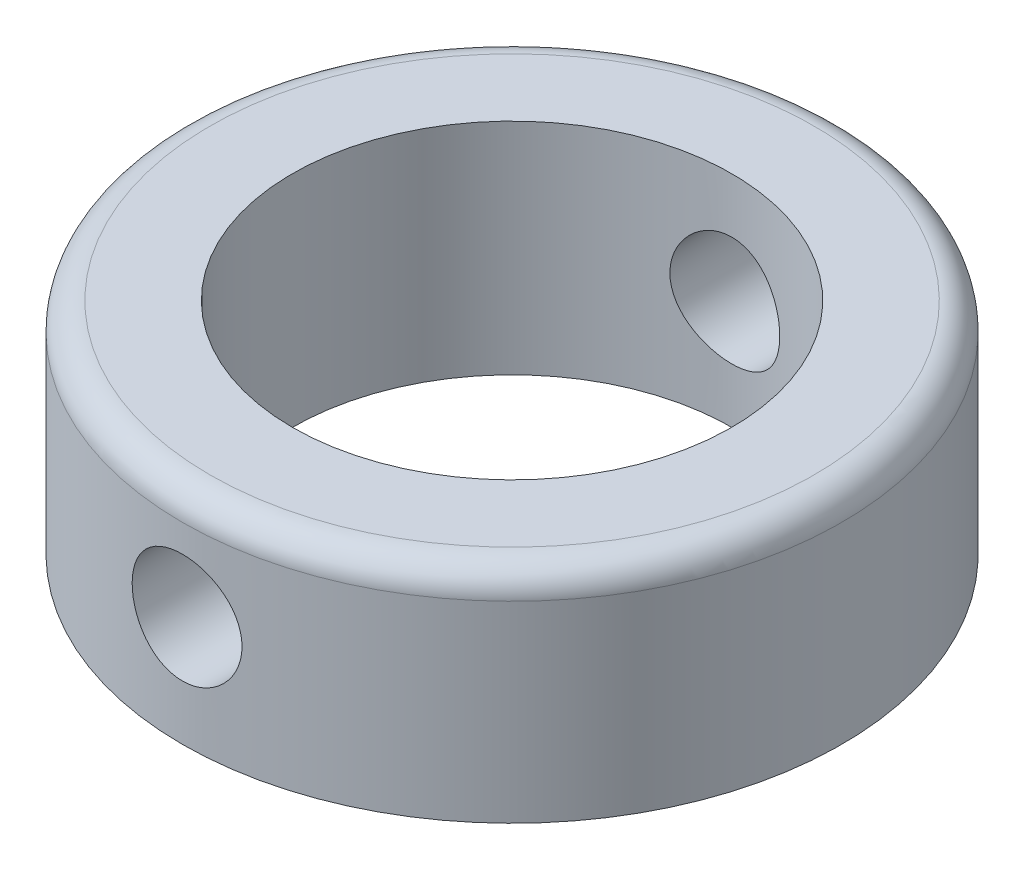
ISO-10303-21;
HEADER;
FILE_DESCRIPTION(('STEP AP214'),'2;1');
FILE_NAME('part.step','',(''),(''),'','','');
FILE_SCHEMA(('AUTOMOTIVE_DESIGN { 1 0 10303 214 1 1 1 1 }'));
ENDSEC;
DATA;
#1=APPLICATION_CONTEXT('core data for automotive mechanical design processes');
#2=APPLICATION_PROTOCOL_DEFINITION('international standard','automotive_design',2000,#1);
#3=PRODUCT_CONTEXT('',#1,'mechanical');
#4=PRODUCT('Part','Part','',(#3));
#5=PRODUCT_RELATED_PRODUCT_CATEGORY('part','',(#4));
#6=PRODUCT_DEFINITION_FORMATION('','',#4);
#7=PRODUCT_DEFINITION_CONTEXT('part definition',#1,'design');
#8=PRODUCT_DEFINITION('design','',#6,#7);
#9=PRODUCT_DEFINITION_SHAPE('','',#8);
#10=(LENGTH_UNIT() NAMED_UNIT(*) SI_UNIT(.MILLI.,.METRE.));
#11=(NAMED_UNIT(*) PLANE_ANGLE_UNIT() SI_UNIT($,.RADIAN.));
#12=(NAMED_UNIT(*) SI_UNIT($,.STERADIAN.) SOLID_ANGLE_UNIT());
#13=UNCERTAINTY_MEASURE_WITH_UNIT(LENGTH_MEASURE(1.E-05),#10,'distance_accuracy_value','');
#14=(GEOMETRIC_REPRESENTATION_CONTEXT(3) GLOBAL_UNCERTAINTY_ASSIGNED_CONTEXT((#13)) GLOBAL_UNIT_ASSIGNED_CONTEXT((#10,
#11,#12)) REPRESENTATION_CONTEXT('',''));
#15=CARTESIAN_POINT('',(0.,0.,0.));
#16=DIRECTION('',(0.,0.,1.));
#17=DIRECTION('',(1.,0.,0.));
#18=AXIS2_PLACEMENT_3D('',#15,#16,#17);
#19=CARTESIAN_POINT('',(0.,8.,0.));
#20=DIRECTION('',(0.,1.,0.));
#21=DIRECTION('',(0.,0.,1.));
#22=AXIS2_PLACEMENT_3D('',#19,#20,#21);
#23=PLANE('',#22);
#24=CARTESIAN_POINT('',(0.,8.,0.));
#25=DIRECTION('',(0.,1.,0.));
#26=DIRECTION('',(0.,0.,1.));
#27=AXIS2_PLACEMENT_3D('',#24,#25,#26);
#28=CIRCLE('',#27,11.);
#29=CARTESIAN_POINT('',(0.,8.,11.));
#30=VERTEX_POINT('',#29);
#31=EDGE_CURVE('E49',#30,#30,#28,.T.);
#32=ORIENTED_EDGE('',*,*,#31,.T.);
#33=EDGE_LOOP('',(#32));
#34=FACE_BOUND('',#33,.T.);
#35=CARTESIAN_POINT('',(0.,8.,0.));
#36=DIRECTION('',(0.,1.,0.));
#37=DIRECTION('',(0.,0.,1.));
#38=AXIS2_PLACEMENT_3D('',#35,#36,#37);
#39=CIRCLE('',#38,8.);
#40=CARTESIAN_POINT('',(0.,8.,8.));
#41=VERTEX_POINT('',#40);
#42=EDGE_CURVE('E59',#41,#41,#39,.T.);
#43=ORIENTED_EDGE('',*,*,#42,.F.);
#44=EDGE_LOOP('',(#43));
#45=FACE_BOUND('',#44,.T.);
#46=ADVANCED_FACE('F41',(#34,#45),#23,.T.);
#47=CARTESIAN_POINT('',(0.,0.,0.));
#48=DIRECTION('',(0.,1.,0.));
#49=DIRECTION('',(0.,0.,1.));
#50=AXIS2_PLACEMENT_3D('',#47,#48,#49);
#51=PLANE('',#50);
#52=CARTESIAN_POINT('',(0.,0.,0.));
#53=DIRECTION('',(0.,1.,0.));
#54=DIRECTION('',(0.,0.,1.));
#55=AXIS2_PLACEMENT_3D('',#52,#53,#54);
#56=CIRCLE('',#55,12.);
#57=CARTESIAN_POINT('',(0.,0.,12.));
#58=VERTEX_POINT('',#57);
#59=EDGE_CURVE('E54',#58,#58,#56,.T.);
#60=ORIENTED_EDGE('',*,*,#59,.F.);
#61=EDGE_LOOP('',(#60));
#62=FACE_BOUND('',#61,.T.);
#63=CARTESIAN_POINT('',(0.,0.,0.));
#64=DIRECTION('',(0.,1.,0.));
#65=DIRECTION('',(0.,0.,1.));
#66=AXIS2_PLACEMENT_3D('',#63,#64,#65);
#67=CIRCLE('',#66,8.);
#68=CARTESIAN_POINT('',(0.,0.,8.));
#69=VERTEX_POINT('',#68);
#70=EDGE_CURVE('E115',#69,#69,#67,.T.);
#71=ORIENTED_EDGE('',*,*,#70,.T.);
#72=EDGE_LOOP('',(#71));
#73=FACE_BOUND('',#72,.T.);
#74=ADVANCED_FACE('F103',(#62,#73),#51,.F.);
#75=CARTESIAN_POINT('',(0.,8.,0.));
#76=DIRECTION('',(0.,-1.,0.));
#77=DIRECTION('',(0.,0.,-1.));
#78=AXIS2_PLACEMENT_3D('',#75,#76,#77);
#79=CYLINDRICAL_SURFACE('',#78,12.);
#80=CARTESIAN_POINT('',(0.,7.,0.));
#81=DIRECTION('',(0.,1.,0.));
#82=DIRECTION('',(0.,0.,1.));
#83=AXIS2_PLACEMENT_3D('',#80,#81,#82);
#84=CIRCLE('',#83,12.);
#85=CARTESIAN_POINT('',(0.,7.,12.));
#86=VERTEX_POINT('',#85);
#87=EDGE_CURVE('E10',#86,#86,#84,.F.);
#88=ORIENTED_EDGE('',*,*,#87,.T.);
#89=EDGE_LOOP('',(#88));
#90=FACE_BOUND('',#89,.T.);
#91=CARTESIAN_POINT('',(0.,6.,-12.));
#92=CARTESIAN_POINT('',(-0.111512723966572,5.99999552884175,-11.9999980893506));
#93=CARTESIAN_POINT('',(-0.223086305471056,5.99064218002486,-11.9984294233043));
#94=CARTESIAN_POINT('',(-0.443104177338434,5.95349147298774,-11.9923227595311));
#95=CARTESIAN_POINT('',(-0.551545494367397,5.92567715447072,-11.9877820313911));
#96=CARTESIAN_POINT('',(-0.762083797770114,5.8524676411258,-11.9762405458916));
#97=CARTESIAN_POINT('',(-0.86418589474552,5.80708682748754,-11.9692418012735));
#98=CARTESIAN_POINT('',(-1.05931347358235,5.70007016635808,-11.9535538166566));
#99=CARTESIAN_POINT('',(-1.15233999190287,5.6384361780136,-11.9448647700355));
#100=CARTESIAN_POINT('',(-1.32757809143334,5.50003593294363,-11.9266665396665));
#101=CARTESIAN_POINT('',(-1.40969032282797,5.4231447082911,-11.9171509745189));
#102=CARTESIAN_POINT('',(-1.55991079892794,5.25668162522175,-11.8984210150139));
#103=CARTESIAN_POINT('',(-1.62801815951278,5.16710896683471,-11.8892066397013));
#104=CARTESIAN_POINT('',(-1.74869370048411,4.97714322704236,-11.8720605260782));
#105=CARTESIAN_POINT('',(-1.8011636422888,4.8766869305562,-11.8641370327331));
#106=CARTESIAN_POINT('',(-1.88844669232897,4.6682323485595,-11.8505583183574));
#107=CARTESIAN_POINT('',(-1.92326099325249,4.5602345730579,-11.8449029441145));
#108=CARTESIAN_POINT('',(-1.97393150222785,4.34081578011477,-11.836564294742));
#109=CARTESIAN_POINT('',(-1.98995922330832,4.22943541079889,-11.8338541478856));
#110=CARTESIAN_POINT('',(-2.0031333802319,4.00553577849322,-11.8316315114932));
#111=CARTESIAN_POINT('',(-2.0002811523112,3.89301659666616,-11.8321187956577));
#112=CARTESIAN_POINT('',(-1.97591607871692,3.67125771097964,-11.8362114309084));
#113=CARTESIAN_POINT('',(-1.95459590551182,3.56199615716382,-11.8397845865513));
#114=CARTESIAN_POINT('',(-1.89420251232276,3.34862294573669,-11.8495959616881));
#115=CARTESIAN_POINT('',(-1.85512868345579,3.24451146488916,-11.8558342725862));
#116=CARTESIAN_POINT('',(-1.76014179687513,3.04381694124727,-11.8703078346728));
#117=CARTESIAN_POINT('',(-1.70414873110377,2.94727247513502,-11.8785525368586));
#118=CARTESIAN_POINT('',(-1.57696961404595,2.76487647956929,-11.8961033473201));
#119=CARTESIAN_POINT('',(-1.50578233652343,2.67902581403606,-11.9054095412343));
#120=CARTESIAN_POINT('',(-1.34918576972724,2.51933913135412,-11.9241762230383));
#121=CARTESIAN_POINT('',(-1.2636111710985,2.44566518516793,-11.9336371938532));
#122=CARTESIAN_POINT('',(-1.08122819918532,2.31369778986773,-11.9515408111738));
#123=CARTESIAN_POINT('',(-0.984419753525138,2.25540443985342,-11.959983451118));
#124=CARTESIAN_POINT('',(-0.78216473293337,2.15583821829097,-11.9749111431433));
#125=CARTESIAN_POINT('',(-0.67671098045173,2.114579664535,-11.9813945472596));
#126=CARTESIAN_POINT('',(-0.460238676482186,2.05040462780322,-11.9916600241013));
#127=CARTESIAN_POINT('',(-0.349220591343575,2.02748661042103,-11.9954423228038));
#128=CARTESIAN_POINT('',(-0.1261679210413,2.00086291323109,-11.9998490387415));
#129=CARTESIAN_POINT('',(-0.0141605897208099,1.99693474255551,-12.0005100241023));
#130=CARTESIAN_POINT('',(0.208911818311909,2.0078090755425,-11.9986997953694));
#131=CARTESIAN_POINT('',(0.31997693111363,2.02261085850699,-11.9962287017929));
#132=CARTESIAN_POINT('',(0.53732494043741,2.07033987946838,-11.9884546155056));
#133=CARTESIAN_POINT('',(0.643632694708302,2.1031569667121,-11.9831688384105));
#134=CARTESIAN_POINT('',(0.849237507888353,2.18586761455963,-11.9703557156429));
#135=CARTESIAN_POINT('',(0.948534172727774,2.23576213410822,-11.9628282440962));
#136=CARTESIAN_POINT('',(1.13826455157517,2.35172089975743,-11.9462761304193));
#137=CARTESIAN_POINT('',(1.22861220074972,2.4179241249338,-11.9372388470962));
#138=CARTESIAN_POINT('',(1.39699486840215,2.56442985230805,-11.9187077391352));
#139=CARTESIAN_POINT('',(1.47502899175726,2.64473337862133,-11.9092138813724));
#140=CARTESIAN_POINT('',(1.6173942237264,2.81815803845714,-11.8907214018868));
#141=CARTESIAN_POINT('',(1.68157500889097,2.91140333241153,-11.8817289290968));
#142=CARTESIAN_POINT('',(1.79336184823599,3.10748237531083,-11.8653722382231));
#143=CARTESIAN_POINT('',(1.84096842781586,3.21031582018199,-11.8580079685282));
#144=CARTESIAN_POINT('',(1.91803066517852,3.4222317862497,-11.8457876295816));
#145=CARTESIAN_POINT('',(1.94756114603836,3.53128647602439,-11.8409212344885));
#146=CARTESIAN_POINT('',(1.98786836302262,3.75289610337741,-11.8342217346821));
#147=CARTESIAN_POINT('',(1.99864672955693,3.86545073578564,-11.8323883662618));
#148=CARTESIAN_POINT('',(2.00109829283788,4.08936413276993,-11.8319738646721));
#149=CARTESIAN_POINT('',(1.99300810890015,4.20072030286023,-11.8333524520452));
#150=CARTESIAN_POINT('',(1.95846387116548,4.42046339844061,-11.8391182516298));
#151=CARTESIAN_POINT('',(1.93200987688998,4.5288503335535,-11.8435054540897));
#152=CARTESIAN_POINT('',(1.86157959167592,4.73948674983409,-11.8547788502538));
#153=CARTESIAN_POINT('',(1.81762367248035,4.84174320804482,-11.8616621377574));
#154=CARTESIAN_POINT('',(1.71346160313273,5.03746853535588,-11.8771549513777));
#155=CARTESIAN_POINT('',(1.65325464699885,5.13093696829771,-11.8857645631072));
#156=CARTESIAN_POINT('',(1.51745510749773,5.3076284664862,-11.903867632365));
#157=CARTESIAN_POINT('',(1.44168845087492,5.39071681336022,-11.9133703646104));
#158=CARTESIAN_POINT('',(1.27728722510419,5.54308128357995,-11.9321149788867));
#159=CARTESIAN_POINT('',(1.18864969033011,5.61235421491054,-11.9413568002124));
#160=CARTESIAN_POINT('',(1.00029533571223,5.73555861455996,-11.9586122371378));
#161=CARTESIAN_POINT('',(0.900506230026255,5.78938083145036,-11.9666169300248));
#162=CARTESIAN_POINT('',(0.693210455503185,5.87941558768794,-11.9804093408142));
#163=CARTESIAN_POINT('',(0.585711595864008,5.91564566486376,-11.9861992654199));
#164=CARTESIAN_POINT('',(0.398162648036321,5.96160421930133,-11.9936463266636));
#165=CARTESIAN_POINT('',(0.319247064238758,5.97597957569277,-11.9960162181869));
#166=CARTESIAN_POINT('',(0.160231448255847,5.9951789902758,-11.999193727889));
#167=CARTESIAN_POINT('',(0.0801314364867954,6.00000321290989,-12.0000013729651));
#168=CARTESIAN_POINT('',(0.,6.,-12.));
#169=B_SPLINE_CURVE_WITH_KNOTS('',3,(#91,#92,#93,#94,#95,#96,#97,#98,#99,#100,#101,#102,#103,
#104,#105,#106,#107,#108,#109,#110,#111,#112,#113,#114,#115,#116,#117,#118,#119,#120,#121,#122,
#123,#124,#125,#126,#127,#128,#129,#130,#131,#132,#133,#134,#135,#136,#137,#138,#139,#140,#141,
#142,#143,#144,#145,#146,#147,#148,#149,#150,#151,#152,#153,#154,#155,#156,#157,#158,#159,#160,
#161,#162,#163,#164,#165,#166,#167,#168),.UNSPECIFIED.,.T.,.F.,(4,2,2,2,2,2,2,2,2,2,2,2,2,2,2,2,
2,2,2,2,2,2,2,2,2,2,2,2,2,2,2,2,2,2,2,2,2,2,4),(0.,0.334245267950807,0.668798036556336,
1.00307749362021,1.33731873013983,1.67441992849866,2.01154240135885,2.35074016659072,
2.68991501500945,3.02596861682739,3.36199843456709,3.69456417408327,4.02714132020305,
4.36131645306046,4.69551856544459,5.03386215929061,5.37220793308678,5.71083751132722,
6.04943875616919,6.38406306793118,6.71867450428688,7.05126245605132,7.38386908660853,
7.71941460501619,8.05498450443426,8.39403057606095,8.73306589900754,9.07068817873417,
9.40828110229294,9.7416632761816,10.0750443695051,10.4080385458098,10.7410492402347,
11.0780110735471,11.4150506710318,11.7544178528576,12.0934460170406,12.3336339853121,
12.5738178182157),.UNSPECIFIED.);
#170=CARTESIAN_POINT('',(0.,6.,-12.));
#171=VERTEX_POINT('',#170);
#172=EDGE_CURVE('E94',#171,#171,#169,.T.);
#173=ORIENTED_EDGE('',*,*,#172,.T.);
#174=EDGE_LOOP('',(#173));
#175=FACE_BOUND('',#174,.T.);
#176=CARTESIAN_POINT('',(2.,4.,11.8321595661992));
#177=CARTESIAN_POINT('',(1.99999551873586,3.88849940147055,11.8321615789328));
#178=CARTESIAN_POINT('',(1.99064413522263,3.77693791514282,11.8337527390819));
#179=CARTESIAN_POINT('',(1.9535019424531,3.55694516538947,11.8399396576003));
#180=CARTESIAN_POINT('',(1.92569412824689,3.44851688499355,11.844538186771));
#181=CARTESIAN_POINT('',(1.8525036349364,3.23800617332672,11.8562048749385));
#182=CARTESIAN_POINT('',(1.80713564394559,3.1359185210702,11.8632709694721));
#183=CARTESIAN_POINT('',(1.70014919751158,2.94081523622578,11.8790741768183));
#184=CARTESIAN_POINT('',(1.63853257080106,2.84779858433814,11.8878111015538));
#185=CARTESIAN_POINT('',(1.50015002157323,2.67254972020435,11.906067769247));
#186=CARTESIAN_POINT('',(1.42325523914587,2.59041989489103,11.9155937386236));
#187=CARTESIAN_POINT('',(1.25677760375622,2.44016535451055,11.9342998453486));
#188=CARTESIAN_POINT('',(1.16719399931998,2.37204146950767,11.9434799621739));
#189=CARTESIAN_POINT('',(0.977218295958686,2.25134834622458,11.9605258958617));
#190=CARTESIAN_POINT('',(0.876764865165368,2.19887439381456,11.9683835394587));
#191=CARTESIAN_POINT('',(0.668316497379096,2.11158314357556,11.9818298956567));
#192=CARTESIAN_POINT('',(0.560322051262552,2.0767646976921,11.9874187557813));
#193=CARTESIAN_POINT('',(0.340914981075395,2.02608597201288,11.9956538777952));
#194=CARTESIAN_POINT('',(0.229543109343418,2.01005366719625,11.9983268248873));
#195=CARTESIAN_POINT('',(0.0056602284206387,1.99686739667792,12.0005206347422));
#196=CARTESIAN_POINT('',(-0.106850702823118,1.99971214780221,12.0000417117545));
#197=CARTESIAN_POINT('',(-0.3286417480631,2.02406508122257,11.9960068674511));
#198=CARTESIAN_POINT('',(-0.437942824560112,2.04538813072732,11.9924814695392));
#199=CARTESIAN_POINT('',(-0.651393583689433,2.10580085939719,11.9827838301731));
#200=CARTESIAN_POINT('',(-0.755543109321203,2.1448910796716,11.9766115081057));
#201=CARTESIAN_POINT('',(-0.956284918226118,2.23991251225225,11.9622615880957));
#202=CARTESIAN_POINT('',(-1.05284041841524,2.29592000966595,11.954074938615));
#203=CARTESIAN_POINT('',(-1.23525242387731,2.42313025810804,11.936605904572));
#204=CARTESIAN_POINT('',(-1.3211080623327,2.49433423896865,11.9273234313531));
#205=CARTESIAN_POINT('',(-1.48077701875733,2.65094304529545,11.9085621458608));
#206=CARTESIAN_POINT('',(-1.55443160180257,2.73650967592079,11.8990823178483));
#207=CARTESIAN_POINT('',(-1.68636367075845,2.91886967217266,11.8811036782784));
#208=CARTESIAN_POINT('',(-1.74464101482593,3.01566314134626,11.8726048757706));
#209=CARTESIAN_POINT('',(-1.84419554759063,3.21791331350199,11.8575500364945));
#210=CARTESIAN_POINT('',(-1.88545362182339,3.32337959847367,11.8509961864208));
#211=CARTESIAN_POINT('',(-1.94962389665249,3.53987925784604,11.840609509519));
#212=CARTESIAN_POINT('',(-1.97253771261436,3.65091214114594,11.8367764431066));
#213=CARTESIAN_POINT('',(-1.99914550790341,3.87397292492971,11.8323116753769));
#214=CARTESIAN_POINT('',(-2.00306576632995,3.98597310376168,11.8316422860694));
#215=CARTESIAN_POINT('',(-1.99217816214597,4.20902933735266,11.8334802782589));
#216=CARTESIAN_POINT('',(-1.97737102289973,4.32008542841118,11.8359875370548));
#217=CARTESIAN_POINT('',(-1.92964186794248,4.53738220735269,11.8438614996401));
#218=CARTESIAN_POINT('',(-1.89683503251711,4.64364891190241,11.8492100153468));
#219=CARTESIAN_POINT('',(-1.81415855215382,4.84917613302359,11.862148584044));
#220=CARTESIAN_POINT('',(-1.76428788648075,4.94843623004072,11.8697387711246));
#221=CARTESIAN_POINT('',(-1.64836533858338,5.13813967552489,11.8863930271791));
#222=CARTESIAN_POINT('',(-1.58216845132749,5.22849325820485,11.8954700448028));
#223=CARTESIAN_POINT('',(-1.43567157256639,5.396890826156,11.9140373334389));
#224=CARTESIAN_POINT('',(-1.35537058910724,5.47493394488779,11.9235276334827));
#225=CARTESIAN_POINT('',(-1.18194245626305,5.61732151418296,11.9419713769461));
#226=CARTESIAN_POINT('',(-1.08869060270896,5.68151506102763,11.9509182107574));
#227=CARTESIAN_POINT('',(-0.892594758359462,5.7933242616039,11.9671608994635));
#228=CARTESIAN_POINT('',(-0.789751077976502,5.84094045157908,11.9744568077598));
#229=CARTESIAN_POINT('',(-0.577839241201064,5.91800846716389,11.9865468653567));
#230=CARTESIAN_POINT('',(-0.468800450082091,5.94753926058794,11.9913518765409));
#231=CARTESIAN_POINT('',(-0.24722458789937,5.98785247917106,11.9979646653543));
#232=CARTESIAN_POINT('',(-0.134687805457297,5.99863644698588,11.9997726896015));
#233=CARTESIAN_POINT('',(0.0892330206189404,6.00110550584976,12.0001843031025));
#234=CARTESIAN_POINT('',(0.200614528482131,5.99302020315287,11.9988264161935));
#235=CARTESIAN_POINT('',(0.420409579451764,5.95847686218446,11.9931374270987));
#236=CARTESIAN_POINT('',(0.528823139173983,5.93201892679226,11.9888063415615));
#237=CARTESIAN_POINT('',(0.73951715673483,5.86156946756508,11.9776559106192));
#238=CARTESIAN_POINT('',(0.841804297723055,5.81759746543196,11.970839336327));
#239=CARTESIAN_POINT('',(1.03758436238573,5.71339365101554,11.9554620550242));
#240=CARTESIAN_POINT('',(1.13107686889458,5.65316106795004,11.9469012653393));
#241=CARTESIAN_POINT('',(1.30777035642112,5.5173319260316,11.9288610369313));
#242=CARTESIAN_POINT('',(1.3908411444822,5.44156723619899,11.919372196329));
#243=CARTESIAN_POINT('',(1.54317110076073,5.27717735367695,11.900610426515));
#244=CARTESIAN_POINT('',(1.61242702936952,5.18854915286997,11.8913375483961));
#245=CARTESIAN_POINT('',(1.73561141672869,5.00020374200831,11.8739867482713));
#246=CARTESIAN_POINT('',(1.78942799124616,4.90041252818761,11.8659177427663));
#247=CARTESIAN_POINT('',(1.87945162912342,4.69311261132948,11.8519936807305));
#248=CARTESIAN_POINT('',(1.91567628417846,4.58561174185811,11.846136413799));
#249=CARTESIAN_POINT('',(1.96162084250194,4.39807698441009,11.8385979588519));
#250=CARTESIAN_POINT('',(1.97598993413711,4.31917855362991,11.8361969873557));
#251=CARTESIAN_POINT('',(1.99518103614505,4.16019721213045,11.8329770823046));
#252=CARTESIAN_POINT('',(2.00000321983422,4.08011432294064,11.8321581200295));
#253=CARTESIAN_POINT('',(2.,4.,11.8321595661992));
#254=B_SPLINE_CURVE_WITH_KNOTS('',3,(#176,#177,#178,#179,#180,#181,#182,#183,#184,#185,#186,
#187,#188,#189,#190,#191,#192,#193,#194,#195,#196,#197,#198,#199,#200,#201,#202,#203,#204,#205,
#206,#207,#208,#209,#210,#211,#212,#213,#214,#215,#216,#217,#218,#219,#220,#221,#222,#223,#224,
#225,#226,#227,#228,#229,#230,#231,#232,#233,#234,#235,#236,#237,#238,#239,#240,#241,#242,#243,
#244,#245,#246,#247,#248,#249,#250,#251,#252,#253),.UNSPECIFIED.,.T.,.F.,(4,2,2,2,2,2,2,2,2,2,2,
2,2,2,2,2,2,2,2,2,2,2,2,2,2,2,2,2,2,2,2,2,2,2,2,2,2,2,4),(0.,0.334208831142192,
0.668726015970375,1.00296399830015,1.33716437924219,1.67431327324572,2.01148214267557,
2.35066384089148,2.6898234808889,3.02585253978052,3.36185875722153,3.69453696931735,
4.02722531399626,4.3614368331154,4.69567540981411,5.03396898769699,5.37226568596815,
5.71094129998883,6.04958708750462,6.38418833936329,6.71877666731181,7.05124851708393,
7.38374025834859,7.71929874210161,8.05488083544551,8.39395290428305,8.73301400381358,
9.07058387534117,9.4081259672988,9.74158221012733,10.0750365857506,10.4081203186597,
10.7412198431387,11.078135979706,11.4151310310545,11.7545098209466,12.0935485339556,
12.3336853643501,12.5738178352145),.UNSPECIFIED.);
#255=CARTESIAN_POINT('',(2.,4.,11.8321595661992));
#256=VERTEX_POINT('',#255);
#257=EDGE_CURVE('E71',#256,#256,#254,.T.);
#258=ORIENTED_EDGE('',*,*,#257,.T.);
#259=EDGE_LOOP('',(#258));
#260=FACE_BOUND('',#259,.T.);
#261=ORIENTED_EDGE('',*,*,#59,.T.);
#262=EDGE_LOOP('',(#261));
#263=FACE_BOUND('',#262,.T.);
#264=ADVANCED_FACE('F99',(#90,#175,#260,#263),#79,.T.);
#265=CARTESIAN_POINT('',(0.,8.,0.));
#266=DIRECTION('',(0.,-1.,0.));
#267=DIRECTION('',(0.,0.,-1.));
#268=AXIS2_PLACEMENT_3D('',#265,#266,#267);
#269=CYLINDRICAL_SURFACE('',#268,8.);
#270=CARTESIAN_POINT('',(0.,6.,-8.));
#271=CARTESIAN_POINT('',(-0.110501451559641,5.99999689901579,-7.9999981315735));
#272=CARTESIAN_POINT('',(-0.221037543774351,5.99081126563495,-7.99768770842435));
#273=CARTESIAN_POINT('',(-0.438941765027377,5.95436646492399,-7.98869485106526));
#274=CARTESIAN_POINT('',(-0.546308062494319,5.92709705394953,-7.98200993893301));
#275=CARTESIAN_POINT('',(-0.754694496243435,5.85541432871722,-7.96500835109376));
#276=CARTESIAN_POINT('',(-0.855722084573335,5.81102160171297,-7.95469603789411));
#277=CARTESIAN_POINT('',(-1.04889617587257,5.70642481327354,-7.93153791743495));
#278=CARTESIAN_POINT('',(-1.14104237913168,5.64622021850804,-7.91869202472209));
#279=CARTESIAN_POINT('',(-1.31573590306789,5.51039894712776,-7.89156551455591));
#280=CARTESIAN_POINT('',(-1.39807425341474,5.43451790005459,-7.87726276197502));
#281=CARTESIAN_POINT('',(-1.54899856960442,5.27006372678796,-7.84898160157248));
#282=CARTESIAN_POINT('',(-1.61758298259892,5.18148916940409,-7.83500323053157));
#283=CARTESIAN_POINT('',(-1.74003539039863,4.99253969768401,-7.80873034264225));
#284=CARTESIAN_POINT('',(-1.79366962123352,4.89200902558836,-7.79646392619748));
#285=CARTESIAN_POINT('',(-1.88319587806766,4.68300211778662,-7.77532659757355));
#286=CARTESIAN_POINT('',(-1.91909074058685,4.57452715555731,-7.76645514259225));
#287=CARTESIAN_POINT('',(-1.97140644907302,4.35500866906446,-7.7533396892843));
#288=CARTESIAN_POINT('',(-1.98820302444274,4.24406013861601,-7.74900654662681));
#289=CARTESIAN_POINT('',(-2.00301570008854,4.02084190800088,-7.74519149946122));
#290=CARTESIAN_POINT('',(-2.00103485575748,3.90857242574382,-7.74570880570571));
#291=CARTESIAN_POINT('',(-1.97864869951961,3.6887789230062,-7.75145607355756));
#292=CARTESIAN_POINT('',(-1.95869112025418,3.58120583804623,-7.75657150676392));
#293=CARTESIAN_POINT('',(-1.90163224920399,3.37098526545192,-7.77075612894759));
#294=CARTESIAN_POINT('',(-1.86452973609252,3.26833812929477,-7.77982559958985));
#295=CARTESIAN_POINT('',(-1.77385263724958,3.06968264499716,-7.80100151874212));
#296=CARTESIAN_POINT('',(-1.72011555631056,2.97375177094724,-7.81313769959755));
#297=CARTESIAN_POINT('',(-1.59780836801993,2.79210838699091,-7.83906281127988));
#298=CARTESIAN_POINT('',(-1.52923566507845,2.70639766924367,-7.85285203112837));
#299=CARTESIAN_POINT('',(-1.37688456624163,2.54506184574079,-7.88101174053188));
#300=CARTESIAN_POINT('',(-1.29272834422115,2.46979401325153,-7.89538759304001));
#301=CARTESIAN_POINT('',(-1.11281589000493,2.3343716767148,-7.92274620771675));
#302=CARTESIAN_POINT('',(-1.01705930361059,2.27421763431525,-7.93572892732543));
#303=CARTESIAN_POINT('',(-0.816154518241856,2.17059921836749,-7.9589030945892));
#304=CARTESIAN_POINT('',(-0.710975190944831,2.12719287966076,-7.96908480170303));
#305=CARTESIAN_POINT('',(-0.49450134419051,2.05877692572057,-7.98543889321888));
#306=CARTESIAN_POINT('',(-0.383207998867313,2.03376379144248,-7.99161204452374));
#307=CARTESIAN_POINT('',(-0.160719960520036,2.00338991258822,-7.999139990285));
#308=CARTESIAN_POINT('',(-0.0495956266509465,1.9975426318996,-8.00061404677705));
#309=CARTESIAN_POINT('',(0.172043833068677,2.00433200274065,-7.99891739752601));
#310=CARTESIAN_POINT('',(0.282559012859459,2.01696699039884,-7.99574710989128));
#311=CARTESIAN_POINT('',(0.498152358368655,2.05996121118851,-7.98519441503143));
#312=CARTESIAN_POINT('',(0.603286825291672,2.09005501796932,-7.97787512247748));
#313=CARTESIAN_POINT('',(0.807009723270014,2.16680944537126,-7.95984942178845));
#314=CARTESIAN_POINT('',(0.905597492043512,2.21347173908423,-7.94914267159856));
#315=CARTESIAN_POINT('',(1.0953641792398,2.3229815051663,-7.92524410568414));
#316=CARTESIAN_POINT('',(1.18638058911444,2.38610148319568,-7.91201156489243));
#317=CARTESIAN_POINT('',(1.35670215152433,2.52638654506263,-7.88459345583226));
#318=CARTESIAN_POINT('',(1.43600527863068,2.60355405282254,-7.87040772335606));
#319=CARTESIAN_POINT('',(1.58265409076364,2.77200261445928,-7.84225275947695));
#320=CARTESIAN_POINT('',(1.64965849016271,2.86358360400323,-7.82829738916375));
#321=CARTESIAN_POINT('',(1.7673476786836,3.05697684595429,-7.80257171169652));
#322=CARTESIAN_POINT('',(1.81803319221058,3.15878864394634,-7.79080130756035));
#323=CARTESIAN_POINT('',(1.90126856081239,3.3692076298841,-7.77090792979554));
#324=CARTESIAN_POINT('',(1.93392586220542,3.47777017112534,-7.76276340389208));
#325=CARTESIAN_POINT('',(1.98046087993837,3.69907951718548,-7.75102325453578));
#326=CARTESIAN_POINT('',(1.99434270330488,3.81182540137665,-7.74742663626581));
#327=CARTESIAN_POINT('',(2.00271812044533,4.03482803180694,-7.74526534938609));
#328=CARTESIAN_POINT('',(1.99775719704016,4.14506324683297,-7.74655910304351));
#329=CARTESIAN_POINT('',(1.96983637108382,4.36307185155731,-7.7537054534379));
#330=CARTESIAN_POINT('',(1.94687683024903,4.47084529068487,-7.75955795855809));
#331=CARTESIAN_POINT('',(1.88390842592373,4.68027794542054,-7.77508347576963));
#332=CARTESIAN_POINT('',(1.84400187290717,4.78196974032028,-7.78473353648412));
#333=CARTESIAN_POINT('',(1.74835321814009,4.97728717695158,-7.80677007633105));
#334=CARTESIAN_POINT('',(1.69260892004558,5.07091169758255,-7.81915693494364));
#335=CARTESIAN_POINT('',(1.56515699818285,5.25007283866936,-7.84567512351349));
#336=CARTESIAN_POINT('',(1.49307088388301,5.33533476456528,-7.85984353109009));
#337=CARTESIAN_POINT('',(1.33571916158631,5.49272939306054,-7.88810702995047));
#338=CARTESIAN_POINT('',(1.25045042834819,5.56485897348396,-7.90220210302746));
#339=CARTESIAN_POINT('',(1.06729011560345,5.69521507808614,-7.92903540863551));
#340=CARTESIAN_POINT('',(0.969197896421849,5.7531661515621,-7.94174444487824));
#341=CARTESIAN_POINT('',(0.764354746013969,5.85166328392071,-7.96406566633491));
#342=CARTESIAN_POINT('',(0.65761008458232,5.89222181419805,-7.97368006933042));
#343=CARTESIAN_POINT('',(0.459213670991296,5.94876244043954,-7.98730746087389));
#344=CARTESIAN_POINT('',(0.368506894544091,5.96793499073791,-7.9920344673692));
#345=CARTESIAN_POINT('',(0.185208095381711,5.99355459149592,-7.99838140309264));
#346=CARTESIAN_POINT('',(0.0926162149901548,6.00000259907373,-8.00000156601192));
#347=CARTESIAN_POINT('',(0.,6.,-8.));
#348=B_SPLINE_CURVE_WITH_KNOTS('',3,(#270,#271,#272,#273,#274,#275,#276,#277,#278,#279,#280,
#281,#282,#283,#284,#285,#286,#287,#288,#289,#290,#291,#292,#293,#294,#295,#296,#297,#298,#299,
#300,#301,#302,#303,#304,#305,#306,#307,#308,#309,#310,#311,#312,#313,#314,#315,#316,#317,#318,
#319,#320,#321,#322,#323,#324,#325,#326,#327,#328,#329,#330,#331,#332,#333,#334,#335,#336,#337,
#338,#339,#340,#341,#342,#343,#344,#345,#346,#347),.UNSPECIFIED.,.T.,.F.,(4,2,2,2,2,2,2,2,2,2,2,
2,2,2,2,2,2,2,2,2,2,2,2,2,2,2,2,2,2,2,2,2,2,2,2,2,2,2,4),(0.,0.331164949962519,
0.662517650351865,0.99347320304814,1.32443992022577,1.66152580582852,1.99864972773416,
2.34078196727742,2.68285948225824,3.01808393468093,3.3532538415469,3.68029996013785,
4.00736937959145,4.337740371696,4.66816921119311,5.00802001296453,5.34788119415424,
5.6889097201658,6.02987298255951,6.36211078603462,6.69431868154751,7.02160366023144,
7.34892169767481,7.68204783424897,8.01523150681786,8.35659345610395,8.69794025003771,
9.03723006156476,9.37644564340971,9.70591707202577,10.0353818794581,10.3628853408369,
10.6904342418696,11.0265276855097,11.3627009303165,11.7049624733721,12.0469781843289,
12.3245632392729,12.6021274139515),.UNSPECIFIED.);
#349=CARTESIAN_POINT('',(0.,6.,-8.));
#350=VERTEX_POINT('',#349);
#351=EDGE_CURVE('E62',#350,#350,#348,.T.);
#352=ORIENTED_EDGE('',*,*,#351,.F.);
#353=EDGE_LOOP('',(#352));
#354=FACE_BOUND('',#353,.T.);
#355=CARTESIAN_POINT('',(2.,4.,7.74596669241483));
#356=CARTESIAN_POINT('',(1.99999686287446,3.88955939925874,7.74596880070288));
#357=CARTESIAN_POINT('',(1.99082099639812,3.77908408105718,7.74835444811678));
#358=CARTESIAN_POINT('',(1.95441850037103,3.56130593746119,7.75761489594051));
#359=CARTESIAN_POINT('',(1.92718136539368,3.45400499642545,7.76449230897304));
#360=CARTESIAN_POINT('',(1.85559295970563,3.24575716945026,7.7819097967692));
#361=CARTESIAN_POINT('',(1.81126378228359,3.14480227569143,7.79244514152366));
#362=CARTESIAN_POINT('',(1.70681691300911,2.9517513179681,7.81598553623007));
#363=CARTESIAN_POINT('',(1.64669855084855,2.85965563033583,7.82899069102791));
#364=CARTESIAN_POINT('',(1.51096674184951,2.68491068379023,7.856325730845));
#365=CARTESIAN_POINT('',(1.43506951016324,2.60248511971996,7.87067678098427));
#366=CARTESIAN_POINT('',(1.27054565128053,2.45139088451173,7.89890300412235));
#367=CARTESIAN_POINT('',(1.18191783534425,2.3827234995026,7.91277813253111));
#368=CARTESIAN_POINT('',(0.992916160863166,2.26017962589498,7.93872332416466));
#369=CARTESIAN_POINT('',(0.892395660956098,2.20652288947083,7.95076549920474));
#370=CARTESIAN_POINT('',(0.683410547434211,2.11695228467753,7.97144649540787));
#371=CARTESIAN_POINT('',(0.574947108633554,2.08103579846759,7.98008581867475));
#372=CARTESIAN_POINT('',(0.355487007003331,2.02868173233713,7.99283807078544));
#373=CARTESIAN_POINT('',(0.244586175639182,2.01186428453873,7.99703915075451));
#374=CARTESIAN_POINT('',(0.0214630554102169,1.99699329657956,8.00074875285838));
#375=CARTESIAN_POINT('',(-0.0907590356304534,1.99893698223232,8.00025796877363));
#376=CARTESIAN_POINT('',(-0.310704494344773,2.02125988020012,7.99470475962828));
#377=CARTESIAN_POINT('',(-0.418472431202133,2.04122906004309,7.98974401872699));
#378=CARTESIAN_POINT('',(-0.629076494827371,2.0983770160388,7.97592669219883));
#379=CARTESIAN_POINT('',(-0.731912358740875,2.13555670830193,7.96706989918753));
#380=CARTESIAN_POINT('',(-0.930813407003613,2.22640205654965,7.94630007760717));
#381=CARTESIAN_POINT('',(-1.02680901953301,2.2802136357294,7.93436015756043));
#382=CARTESIAN_POINT('',(-1.20855124468098,2.40268454329301,7.90871923047719));
#383=CARTESIAN_POINT('',(-1.29429607017101,2.4713464548485,7.89501791721992));
#384=CARTESIAN_POINT('',(-1.45554807016991,2.6237669935859,7.86690971015616));
#385=CARTESIAN_POINT('',(-1.5307153581504,2.70788391387822,7.85249375620734));
#386=CARTESIAN_POINT('',(-1.66595275192604,2.8876799788322,7.82492034813365));
#387=CARTESIAN_POINT('',(-1.72602215209203,2.9833596635928,7.81176295284776));
#388=CARTESIAN_POINT('',(-1.8295762580452,3.18423202731917,7.78816397465319));
#389=CARTESIAN_POINT('',(-1.87297913394098,3.28946858425056,7.77773586980577));
#390=CARTESIAN_POINT('',(-1.94137124127268,3.50606837446116,7.76094912111966));
#391=CARTESIAN_POINT('',(-1.96636441310582,3.61743029118651,7.75458960648175));
#392=CARTESIAN_POINT('',(-1.99666371093214,3.8399676012185,7.74684284831312));
#393=CARTESIAN_POINT('',(-2.0024723791357,3.9510702346637,7.74532871274918));
#394=CARTESIAN_POINT('',(-1.99561359241244,4.17265754926253,7.74709874784831));
#395=CARTESIAN_POINT('',(-1.98294783827904,4.28314228636099,7.75038247681013));
#396=CARTESIAN_POINT('',(-1.93994037115013,4.49849141196376,7.76125665563648));
#397=CARTESIAN_POINT('',(-1.9098912546254,4.60341818125667,7.768775761875));
#398=CARTESIAN_POINT('',(-1.8332944653365,4.80674516628134,7.7872057461677));
#399=CARTESIAN_POINT('',(-1.78674483817004,4.90514460724427,7.79811702598891));
#400=CARTESIAN_POINT('',(-1.67741653434925,5.09475302229388,7.8223690967461));
#401=CARTESIAN_POINT('',(-1.6143374030685,5.18578307203448,7.83575334885313));
#402=CARTESIAN_POINT('',(-1.47412058586891,5.35615069024108,7.86333666457373));
#403=CARTESIAN_POINT('',(-1.39698058961088,5.43548633332006,7.87753586182776));
#404=CARTESIAN_POINT('',(-1.22852544196945,5.58224883405676,7.90557922425285));
#405=CARTESIAN_POINT('',(-1.13690390506319,5.64932805003905,7.91940561649468));
#406=CARTESIAN_POINT('',(-0.943405365389352,5.76714869356099,7.94477773290987));
#407=CARTESIAN_POINT('',(-0.841528897915184,5.81789097328656,7.95632357603169));
#408=CARTESIAN_POINT('',(-0.631116403462183,5.90115682762235,7.9757609259065));
#409=CARTESIAN_POINT('',(-0.522634762055766,5.93381142750325,7.98367864017925));
#410=CARTESIAN_POINT('',(-0.301499520637616,5.98036826768673,7.99508234716634));
#411=CARTESIAN_POINT('',(-0.188846730082483,5.99427412699123,7.99856919514738));
#412=CARTESIAN_POINT('',(0.034167052886645,6.00273517915108,8.00068338817612));
#413=CARTESIAN_POINT('',(0.144507653932042,5.99780341819082,7.99943957759977));
#414=CARTESIAN_POINT('',(0.362734992829501,5.9699043454113,7.99251792914887));
#415=CARTESIAN_POINT('',(0.470621803561856,5.94693756997366,7.98684022314338));
#416=CARTESIAN_POINT('',(0.680342071289547,5.88389556045828,7.97170865707778));
#417=CARTESIAN_POINT('',(0.782204989161724,5.84391309337124,7.96227529004785));
#418=CARTESIAN_POINT('',(0.977834106083247,5.74805884196086,7.94062577827316));
#419=CARTESIAN_POINT('',(1.07159928253127,5.69218505465903,7.92840928277515));
#420=CARTESIAN_POINT('',(1.25080385684661,5.56456953200773,7.90214499360574));
#421=CARTESIAN_POINT('',(1.33598997659667,5.49247971419234,7.88806033883329));
#422=CARTESIAN_POINT('',(1.49323004054701,5.33515429604531,7.85981298114379));
#423=CARTESIAN_POINT('',(1.56528065015318,5.24991536777767,7.84565025934604));
#424=CARTESIAN_POINT('',(1.69552405294366,5.06679717162108,7.81854951691005));
#425=CARTESIAN_POINT('',(1.75343323883276,4.96871175326949,7.80563927346578));
#426=CARTESIAN_POINT('',(1.85185379317094,4.76388902025036,7.78287910989656));
#427=CARTESIAN_POINT('',(1.8923778195043,4.65715806781231,7.77302696466427));
#428=CARTESIAN_POINT('',(1.94884505714201,4.45884597632968,7.75903817501475));
#429=CARTESIAN_POINT('',(1.96798634119376,4.36821367122773,7.75417326006998));
#430=CARTESIAN_POINT('',(1.99356458514354,4.18506226200462,7.7476367716524));
#431=CARTESIAN_POINT('',(2.0000026287435,4.0925433195112,7.74596492578215));
#432=CARTESIAN_POINT('',(2.,4.,7.74596669241483));
#433=B_SPLINE_CURVE_WITH_KNOTS('',3,(#355,#356,#357,#358,#359,#360,#361,#362,#363,#364,#365,
#366,#367,#368,#369,#370,#371,#372,#373,#374,#375,#376,#377,#378,#379,#380,#381,#382,#383,#384,
#385,#386,#387,#388,#389,#390,#391,#392,#393,#394,#395,#396,#397,#398,#399,#400,#401,#402,#403,
#404,#405,#406,#407,#408,#409,#410,#411,#412,#413,#414,#415,#416,#417,#418,#419,#420,#421,#422,
#423,#424,#425,#426,#427,#428,#429,#430,#431,#432),.UNSPECIFIED.,.T.,.F.,(4,2,2,2,2,2,2,2,2,2,2,
2,2,2,2,2,2,2,2,2,2,2,2,2,2,2,2,2,2,2,2,2,2,2,2,2,2,2,4),(0.,0.330981953388908,
0.662156593142932,0.992904581732815,1.32366661404383,1.66099163354381,1.99834817183893,
2.34041197118336,2.68242527877674,3.01751000796277,3.35254518932816,3.68014610151157,
4.00776445379829,4.33834299403555,4.6689790837513,5.00856373257529,5.34816424959841,
5.68941145606722,6.03058560103638,6.36274859809373,6.69488101747041,7.02157924007365,
7.34831617137134,7.68146276687326,8.01466415108035,8.35620264772255,8.69772332575642,
9.03673658245543,9.3756843912723,9.70546756901965,10.0352409390158,10.3632390124777,
10.6912784459046,11.0271767726566,11.3631602525241,11.7054118182895,12.0474137709606,
12.3247826174462,12.6021278008238),.UNSPECIFIED.);
#434=CARTESIAN_POINT('',(2.,4.,7.74596669241483));
#435=VERTEX_POINT('',#434);
#436=EDGE_CURVE('E72',#435,#435,#433,.T.);
#437=ORIENTED_EDGE('',*,*,#436,.F.);
#438=EDGE_LOOP('',(#437));
#439=FACE_BOUND('',#438,.T.);
#440=ORIENTED_EDGE('',*,*,#42,.T.);
#441=EDGE_LOOP('',(#440));
#442=FACE_BOUND('',#441,.T.);
#443=ORIENTED_EDGE('',*,*,#70,.F.);
#444=EDGE_LOOP('',(#443));
#445=FACE_BOUND('',#444,.T.);
#446=ADVANCED_FACE('F76',(#354,#439,#442,#445),#269,.F.);
#447=CARTESIAN_POINT('',(0.,4.,-21.));
#448=DIRECTION('',(0.,0.,1.));
#449=DIRECTION('',(1.,0.,0.));
#450=AXIS2_PLACEMENT_3D('',#447,#448,#449);
#451=CYLINDRICAL_SURFACE('',#450,2.);
#452=ORIENTED_EDGE('',*,*,#436,.T.);
#453=EDGE_LOOP('',(#452));
#454=FACE_BOUND('',#453,.T.);
#455=ORIENTED_EDGE('',*,*,#257,.F.);
#456=EDGE_LOOP('',(#455));
#457=FACE_BOUND('',#456,.T.);
#458=ADVANCED_FACE('F82',(#454,#457),#451,.F.);
#459=ORIENTED_EDGE('',*,*,#351,.T.);
#460=EDGE_LOOP('',(#459));
#461=FACE_BOUND('',#460,.T.);
#462=ORIENTED_EDGE('',*,*,#172,.F.);
#463=EDGE_LOOP('',(#462));
#464=FACE_BOUND('',#463,.T.);
#465=ADVANCED_FACE('F79',(#461,#464),#451,.F.);
#466=CARTESIAN_POINT('',(0.,7.,0.));
#467=DIRECTION('',(0.,1.,0.));
#468=DIRECTION('',(0.,0.,1.));
#469=AXIS2_PLACEMENT_3D('',#466,#467,#468);
#470=TOROIDAL_SURFACE('',#469,11.,1.);
#471=ORIENTED_EDGE('',*,*,#87,.F.);
#472=EDGE_LOOP('',(#471));
#473=FACE_BOUND('',#472,.T.);
#474=ORIENTED_EDGE('',*,*,#31,.F.);
#475=EDGE_LOOP('',(#474));
#476=FACE_BOUND('',#475,.T.);
#477=ADVANCED_FACE('F43',(#473,#476),#470,.T.);
#478=CLOSED_SHELL('',(#46,#74,#264,#446,#458,#465,#477));
#479=MANIFOLD_SOLID_BREP('B2',#478);
#480=ADVANCED_BREP_SHAPE_REPRESENTATION('',(#18,#479),#14);
#481=SHAPE_DEFINITION_REPRESENTATION(#9,#480);
ENDSEC;
END-ISO-10303-21;
